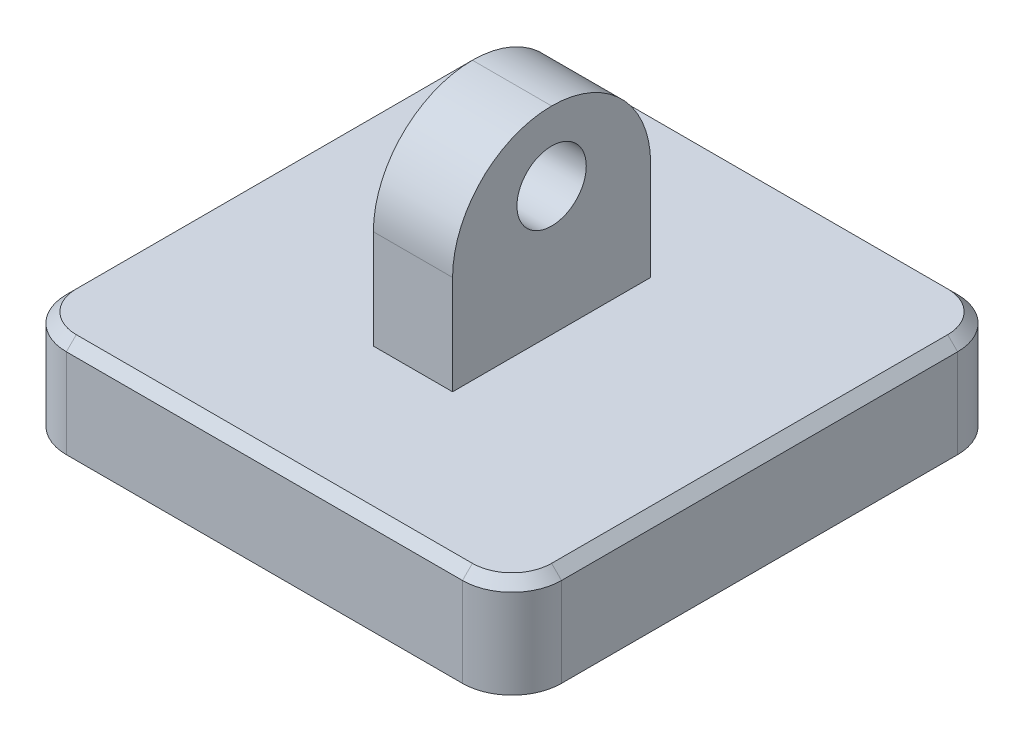
ISO-10303-21;
HEADER;
FILE_DESCRIPTION(('STEP AP214'),'2;1');
FILE_NAME('part.step','',(''),(''),'','','');
FILE_SCHEMA(('AUTOMOTIVE_DESIGN { 1 0 10303 214 1 1 1 1 }'));
ENDSEC;
DATA;
#1=APPLICATION_CONTEXT('core data for automotive mechanical design processes');
#2=APPLICATION_PROTOCOL_DEFINITION('international standard','automotive_design',2000,#1);
#3=PRODUCT_CONTEXT('',#1,'mechanical');
#4=PRODUCT('Part','Part','',(#3));
#5=PRODUCT_RELATED_PRODUCT_CATEGORY('part','',(#4));
#6=PRODUCT_DEFINITION_FORMATION('','',#4);
#7=PRODUCT_DEFINITION_CONTEXT('part definition',#1,'design');
#8=PRODUCT_DEFINITION('design','',#6,#7);
#9=PRODUCT_DEFINITION_SHAPE('','',#8);
#10=(LENGTH_UNIT() NAMED_UNIT(*) SI_UNIT(.MILLI.,.METRE.));
#11=(NAMED_UNIT(*) PLANE_ANGLE_UNIT() SI_UNIT($,.RADIAN.));
#12=(NAMED_UNIT(*) SI_UNIT($,.STERADIAN.) SOLID_ANGLE_UNIT());
#13=UNCERTAINTY_MEASURE_WITH_UNIT(LENGTH_MEASURE(1.E-05),#10,'distance_accuracy_value','');
#14=(GEOMETRIC_REPRESENTATION_CONTEXT(3) GLOBAL_UNCERTAINTY_ASSIGNED_CONTEXT((#13)) GLOBAL_UNIT_ASSIGNED_CONTEXT((#10,
#11,#12)) REPRESENTATION_CONTEXT('',''));
#15=CARTESIAN_POINT('',(0.,0.,0.));
#16=DIRECTION('',(0.,0.,1.));
#17=DIRECTION('',(1.,0.,0.));
#18=AXIS2_PLACEMENT_3D('',#15,#16,#17);
#19=CARTESIAN_POINT('',(0.,10.,0.));
#20=DIRECTION('',(0.,-1.,0.));
#21=DIRECTION('',(0.,0.,-1.));
#22=AXIS2_PLACEMENT_3D('',#19,#20,#21);
#23=PLANE('',#22);
#24=DIRECTION('',(0.,0.,1.));
#25=VECTOR('',#24,1.);
#26=CARTESIAN_POINT('',(-24.,10.,0.));
#27=LINE('',#26,#25);
#28=CARTESIAN_POINT('',(-24.,10.,-20.));
#29=VERTEX_POINT('',#28);
#30=CARTESIAN_POINT('',(-24.,10.,20.));
#31=VERTEX_POINT('',#30);
#32=EDGE_CURVE('E297',#29,#31,#27,.T.);
#33=ORIENTED_EDGE('',*,*,#32,.T.);
#34=CARTESIAN_POINT('',(-20.,10.,20.));
#35=DIRECTION('',(0.,-1.,0.));
#36=DIRECTION('',(0.,0.,-1.));
#37=AXIS2_PLACEMENT_3D('',#34,#35,#36);
#38=CIRCLE('',#37,4.);
#39=CARTESIAN_POINT('',(-20.,10.,24.));
#40=VERTEX_POINT('',#39);
#41=EDGE_CURVE('E300',#31,#40,#38,.F.);
#42=ORIENTED_EDGE('',*,*,#41,.T.);
#43=DIRECTION('',(1.,0.,0.));
#44=VECTOR('',#43,1.);
#45=CARTESIAN_POINT('',(0.,10.,24.));
#46=LINE('',#45,#44);
#47=CARTESIAN_POINT('',(20.,10.,24.));
#48=VERTEX_POINT('',#47);
#49=EDGE_CURVE('E280',#40,#48,#46,.T.);
#50=ORIENTED_EDGE('',*,*,#49,.T.);
#51=CARTESIAN_POINT('',(20.,10.,20.));
#52=DIRECTION('',(0.,-1.,0.));
#53=DIRECTION('',(0.,0.,-1.));
#54=AXIS2_PLACEMENT_3D('',#51,#52,#53);
#55=CIRCLE('',#54,4.);
#56=CARTESIAN_POINT('',(24.,10.,20.));
#57=VERTEX_POINT('',#56);
#58=EDGE_CURVE('E283',#48,#57,#55,.F.);
#59=ORIENTED_EDGE('',*,*,#58,.T.);
#60=DIRECTION('',(0.,0.,-1.));
#61=VECTOR('',#60,1.);
#62=CARTESIAN_POINT('',(24.,10.,0.));
#63=LINE('',#62,#61);
#64=CARTESIAN_POINT('',(24.,10.,-20.));
#65=VERTEX_POINT('',#64);
#66=EDGE_CURVE('E286',#57,#65,#63,.T.);
#67=ORIENTED_EDGE('',*,*,#66,.T.);
#68=CARTESIAN_POINT('',(20.,10.,-20.));
#69=DIRECTION('',(0.,-1.,0.));
#70=DIRECTION('',(0.,0.,-1.));
#71=AXIS2_PLACEMENT_3D('',#68,#69,#70);
#72=CIRCLE('',#71,4.);
#73=CARTESIAN_POINT('',(20.,10.,-24.));
#74=VERTEX_POINT('',#73);
#75=EDGE_CURVE('E289',#65,#74,#72,.F.);
#76=ORIENTED_EDGE('',*,*,#75,.T.);
#77=DIRECTION('',(-1.,0.,0.));
#78=VECTOR('',#77,1.);
#79=CARTESIAN_POINT('',(0.,10.,-24.));
#80=LINE('',#79,#78);
#81=CARTESIAN_POINT('',(-20.,10.,-24.));
#82=VERTEX_POINT('',#81);
#83=EDGE_CURVE('E291',#74,#82,#80,.T.);
#84=ORIENTED_EDGE('',*,*,#83,.T.);
#85=CARTESIAN_POINT('',(-20.,10.,-20.));
#86=DIRECTION('',(0.,-1.,0.));
#87=DIRECTION('',(0.,0.,-1.));
#88=AXIS2_PLACEMENT_3D('',#85,#86,#87);
#89=CIRCLE('',#88,4.);
#90=EDGE_CURVE('E294',#82,#29,#89,.F.);
#91=ORIENTED_EDGE('',*,*,#90,.T.);
#92=EDGE_LOOP('',(#33,#42,#50,#59,#67,#76,#84,#91));
#93=FACE_BOUND('',#92,.T.);
#94=DIRECTION('',(0.,0.,1.));
#95=VECTOR('',#94,1.);
#96=CARTESIAN_POINT('',(-4.,10.,-10.));
#97=LINE('',#96,#95);
#98=CARTESIAN_POINT('',(-4.,10.,-10.));
#99=VERTEX_POINT('',#98);
#100=CARTESIAN_POINT('',(-4.,10.,10.));
#101=VERTEX_POINT('',#100);
#102=EDGE_CURVE('E165',#99,#101,#97,.T.);
#103=ORIENTED_EDGE('',*,*,#102,.F.);
#104=DIRECTION('',(-1.,0.,0.));
#105=VECTOR('',#104,1.);
#106=CARTESIAN_POINT('',(4.,10.,-10.));
#107=LINE('',#106,#105);
#108=CARTESIAN_POINT('',(4.,10.,-10.));
#109=VERTEX_POINT('',#108);
#110=EDGE_CURVE('E174',#109,#99,#107,.T.);
#111=ORIENTED_EDGE('',*,*,#110,.F.);
#112=DIRECTION('',(0.,0.,-1.));
#113=VECTOR('',#112,1.);
#114=CARTESIAN_POINT('',(4.,10.,-10.));
#115=LINE('',#114,#113);
#116=CARTESIAN_POINT('',(4.,10.,10.));
#117=VERTEX_POINT('',#116);
#118=EDGE_CURVE('E189',#117,#109,#115,.T.);
#119=ORIENTED_EDGE('',*,*,#118,.F.);
#120=DIRECTION('',(1.,0.,0.));
#121=VECTOR('',#120,1.);
#122=CARTESIAN_POINT('',(4.,10.,10.));
#123=LINE('',#122,#121);
#124=EDGE_CURVE('E182',#101,#117,#123,.T.);
#125=ORIENTED_EDGE('',*,*,#124,.F.);
#126=EDGE_LOOP('',(#103,#111,#119,#125));
#127=FACE_BOUND('',#126,.T.);
#128=ADVANCED_FACE('F39',(#93,#127),#23,.F.);
#129=CARTESIAN_POINT('',(25.,10.,25.));
#130=DIRECTION('',(-1.,0.,0.));
#131=DIRECTION('',(0.,0.,1.));
#132=AXIS2_PLACEMENT_3D('',#129,#130,#131);
#133=PLANE('',#132);
#134=DIRECTION('',(0.,-1.,0.));
#135=VECTOR('',#134,1.);
#136=CARTESIAN_POINT('',(25.,10.,-20.));
#137=LINE('',#136,#135);
#138=CARTESIAN_POINT('',(25.,0.,-20.));
#139=VERTEX_POINT('',#138);
#140=CARTESIAN_POINT('',(25.,8.99999999999999,-20.));
#141=VERTEX_POINT('',#140);
#142=EDGE_CURVE('E271',#139,#141,#137,.F.);
#143=ORIENTED_EDGE('',*,*,#142,.T.);
#144=DIRECTION('',(0.,0.,1.));
#145=VECTOR('',#144,1.);
#146=CARTESIAN_POINT('',(25.,8.99999999999999,25.));
#147=LINE('',#146,#145);
#148=CARTESIAN_POINT('',(25.,8.99999999999999,20.));
#149=VERTEX_POINT('',#148);
#150=EDGE_CURVE('E64',#141,#149,#147,.T.);
#151=ORIENTED_EDGE('',*,*,#150,.T.);
#152=DIRECTION('',(0.,-1.,0.));
#153=VECTOR('',#152,1.);
#154=CARTESIAN_POINT('',(25.,10.,20.));
#155=LINE('',#154,#153);
#156=CARTESIAN_POINT('',(25.,0.,20.));
#157=VERTEX_POINT('',#156);
#158=EDGE_CURVE('E268',#149,#157,#155,.T.);
#159=ORIENTED_EDGE('',*,*,#158,.T.);
#160=DIRECTION('',(0.,0.,-1.));
#161=VECTOR('',#160,1.);
#162=CARTESIAN_POINT('',(25.,0.,25.));
#163=LINE('',#162,#161);
#164=EDGE_CURVE('E205',#157,#139,#163,.T.);
#165=ORIENTED_EDGE('',*,*,#164,.T.);
#166=EDGE_LOOP('',(#143,#151,#159,#165));
#167=FACE_BOUND('',#166,.T.);
#168=ADVANCED_FACE('F367',(#167),#133,.F.);
#169=CARTESIAN_POINT('',(-25.,10.,-25.));
#170=DIRECTION('',(0.,0.,1.));
#171=DIRECTION('',(1.,0.,0.));
#172=AXIS2_PLACEMENT_3D('',#169,#170,#171);
#173=PLANE('',#172);
#174=DIRECTION('',(0.,-1.,0.));
#175=VECTOR('',#174,1.);
#176=CARTESIAN_POINT('',(-20.,10.,-25.));
#177=LINE('',#176,#175);
#178=CARTESIAN_POINT('',(-20.,0.,-25.));
#179=VERTEX_POINT('',#178);
#180=CARTESIAN_POINT('',(-20.,8.99999999999999,-25.));
#181=VERTEX_POINT('',#180);
#182=EDGE_CURVE('E264',#179,#181,#177,.F.);
#183=ORIENTED_EDGE('',*,*,#182,.T.);
#184=DIRECTION('',(1.,0.,0.));
#185=VECTOR('',#184,1.);
#186=CARTESIAN_POINT('',(-25.,8.99999999999999,-25.));
#187=LINE('',#186,#185);
#188=CARTESIAN_POINT('',(20.,8.99999999999999,-25.));
#189=VERTEX_POINT('',#188);
#190=EDGE_CURVE('E314',#181,#189,#187,.T.);
#191=ORIENTED_EDGE('',*,*,#190,.T.);
#192=DIRECTION('',(0.,-1.,0.));
#193=VECTOR('',#192,1.);
#194=CARTESIAN_POINT('',(20.,10.,-25.));
#195=LINE('',#194,#193);
#196=CARTESIAN_POINT('',(20.,0.,-25.));
#197=VERTEX_POINT('',#196);
#198=EDGE_CURVE('E261',#189,#197,#195,.T.);
#199=ORIENTED_EDGE('',*,*,#198,.T.);
#200=DIRECTION('',(-1.,0.,0.));
#201=VECTOR('',#200,1.);
#202=CARTESIAN_POINT('',(-25.,0.,-25.));
#203=LINE('',#202,#201);
#204=EDGE_CURVE('E208',#197,#179,#203,.T.);
#205=ORIENTED_EDGE('',*,*,#204,.T.);
#206=EDGE_LOOP('',(#183,#191,#199,#205));
#207=FACE_BOUND('',#206,.T.);
#208=ADVANCED_FACE('F378',(#207),#173,.F.);
#209=CARTESIAN_POINT('',(-25.,10.,25.));
#210=DIRECTION('',(1.,0.,0.));
#211=DIRECTION('',(0.,0.,-1.));
#212=AXIS2_PLACEMENT_3D('',#209,#210,#211);
#213=PLANE('',#212);
#214=DIRECTION('',(0.,-1.,0.));
#215=VECTOR('',#214,1.);
#216=CARTESIAN_POINT('',(-25.,10.,20.));
#217=LINE('',#216,#215);
#218=CARTESIAN_POINT('',(-25.,0.,20.));
#219=VERTEX_POINT('',#218);
#220=CARTESIAN_POINT('',(-25.,8.99999999999999,20.));
#221=VERTEX_POINT('',#220);
#222=EDGE_CURVE('E237',#219,#221,#217,.F.);
#223=ORIENTED_EDGE('',*,*,#222,.T.);
#224=DIRECTION('',(0.,0.,-1.));
#225=VECTOR('',#224,1.);
#226=CARTESIAN_POINT('',(-25.,8.99999999999999,25.));
#227=LINE('',#226,#225);
#228=CARTESIAN_POINT('',(-25.,8.99999999999999,-20.));
#229=VERTEX_POINT('',#228);
#230=EDGE_CURVE('E308',#221,#229,#227,.T.);
#231=ORIENTED_EDGE('',*,*,#230,.T.);
#232=DIRECTION('',(0.,-1.,0.));
#233=VECTOR('',#232,1.);
#234=CARTESIAN_POINT('',(-25.,10.,-20.));
#235=LINE('',#234,#233);
#236=CARTESIAN_POINT('',(-25.,0.,-20.));
#237=VERTEX_POINT('',#236);
#238=EDGE_CURVE('E246',#229,#237,#235,.T.);
#239=ORIENTED_EDGE('',*,*,#238,.T.);
#240=DIRECTION('',(0.,0.,1.));
#241=VECTOR('',#240,1.);
#242=CARTESIAN_POINT('',(-25.,0.,25.));
#243=LINE('',#242,#241);
#244=EDGE_CURVE('E212',#237,#219,#243,.T.);
#245=ORIENTED_EDGE('',*,*,#244,.T.);
#246=EDGE_LOOP('',(#223,#231,#239,#245));
#247=FACE_BOUND('',#246,.T.);
#248=ADVANCED_FACE('F435',(#247),#213,.F.);
#249=CARTESIAN_POINT('',(-25.,10.,25.));
#250=DIRECTION('',(0.,0.,-1.));
#251=DIRECTION('',(-1.,0.,0.));
#252=AXIS2_PLACEMENT_3D('',#249,#250,#251);
#253=PLANE('',#252);
#254=DIRECTION('',(0.,-1.,0.));
#255=VECTOR('',#254,1.);
#256=CARTESIAN_POINT('',(20.,10.,25.));
#257=LINE('',#256,#255);
#258=CARTESIAN_POINT('',(20.,0.,25.));
#259=VERTEX_POINT('',#258);
#260=CARTESIAN_POINT('',(20.,8.99999999999999,25.));
#261=VERTEX_POINT('',#260);
#262=EDGE_CURVE('E277',#259,#261,#257,.F.);
#263=ORIENTED_EDGE('',*,*,#262,.T.);
#264=DIRECTION('',(-1.,0.,0.));
#265=VECTOR('',#264,1.);
#266=CARTESIAN_POINT('',(-25.,8.99999999999999,25.));
#267=LINE('',#266,#265);
#268=CARTESIAN_POINT('',(-20.,8.99999999999999,25.));
#269=VERTEX_POINT('',#268);
#270=EDGE_CURVE('E11',#261,#269,#267,.T.);
#271=ORIENTED_EDGE('',*,*,#270,.T.);
#272=DIRECTION('',(0.,-1.,0.));
#273=VECTOR('',#272,1.);
#274=CARTESIAN_POINT('',(-20.,10.,25.));
#275=LINE('',#274,#273);
#276=CARTESIAN_POINT('',(-20.,0.,25.));
#277=VERTEX_POINT('',#276);
#278=EDGE_CURVE('E274',#269,#277,#275,.T.);
#279=ORIENTED_EDGE('',*,*,#278,.T.);
#280=DIRECTION('',(1.,0.,0.));
#281=VECTOR('',#280,1.);
#282=CARTESIAN_POINT('',(-25.,0.,25.));
#283=LINE('',#282,#281);
#284=EDGE_CURVE('E216',#277,#259,#283,.T.);
#285=ORIENTED_EDGE('',*,*,#284,.T.);
#286=EDGE_LOOP('',(#263,#271,#279,#285));
#287=FACE_BOUND('',#286,.T.);
#288=ADVANCED_FACE('F407',(#287),#253,.F.);
#289=CARTESIAN_POINT('',(0.,0.,0.));
#290=DIRECTION('',(0.,-1.,0.));
#291=DIRECTION('',(0.,0.,-1.));
#292=AXIS2_PLACEMENT_3D('',#289,#290,#291);
#293=PLANE('',#292);
#294=ORIENTED_EDGE('',*,*,#244,.F.);
#295=CARTESIAN_POINT('',(-20.,0.,-20.));
#296=DIRECTION('',(0.,-1.,0.));
#297=DIRECTION('',(0.,0.,-1.));
#298=AXIS2_PLACEMENT_3D('',#295,#296,#297);
#299=CIRCLE('',#298,5.);
#300=EDGE_CURVE('E258',#237,#179,#299,.T.);
#301=ORIENTED_EDGE('',*,*,#300,.T.);
#302=ORIENTED_EDGE('',*,*,#204,.F.);
#303=CARTESIAN_POINT('',(20.,0.,-20.));
#304=DIRECTION('',(0.,-1.,0.));
#305=DIRECTION('',(0.,0.,-1.));
#306=AXIS2_PLACEMENT_3D('',#303,#304,#305);
#307=CIRCLE('',#306,5.);
#308=EDGE_CURVE('E255',#197,#139,#307,.T.);
#309=ORIENTED_EDGE('',*,*,#308,.T.);
#310=ORIENTED_EDGE('',*,*,#164,.F.);
#311=CARTESIAN_POINT('',(20.,0.,20.));
#312=DIRECTION('',(0.,-1.,0.));
#313=DIRECTION('',(0.,0.,-1.));
#314=AXIS2_PLACEMENT_3D('',#311,#312,#313);
#315=CIRCLE('',#314,5.);
#316=EDGE_CURVE('E252',#157,#259,#315,.T.);
#317=ORIENTED_EDGE('',*,*,#316,.T.);
#318=ORIENTED_EDGE('',*,*,#284,.F.);
#319=CARTESIAN_POINT('',(-20.,0.,20.));
#320=DIRECTION('',(0.,-1.,0.));
#321=DIRECTION('',(0.,0.,-1.));
#322=AXIS2_PLACEMENT_3D('',#319,#320,#321);
#323=CIRCLE('',#322,5.);
#324=EDGE_CURVE('E249',#277,#219,#323,.T.);
#325=ORIENTED_EDGE('',*,*,#324,.T.);
#326=EDGE_LOOP('',(#294,#301,#302,#309,#310,#317,#318,#325));
#327=FACE_BOUND('',#326,.T.);
#328=ADVANCED_FACE('F372',(#327),#293,.T.);
#329=CARTESIAN_POINT('',(-4.,30.,-10.));
#330=DIRECTION('',(1.,0.,0.));
#331=DIRECTION('',(0.,0.,-1.));
#332=AXIS2_PLACEMENT_3D('',#329,#330,#331);
#333=PLANE('',#332);
#334=CARTESIAN_POINT('',(-4.,23.,0.));
#335=DIRECTION('',(1.,0.,0.));
#336=DIRECTION('',(0.,0.,-1.));
#337=AXIS2_PLACEMENT_3D('',#334,#335,#336);
#338=CIRCLE('',#337,3.5);
#339=CARTESIAN_POINT('',(-4.,23.,-3.5));
#340=VERTEX_POINT('',#339);
#341=EDGE_CURVE('E184',#340,#340,#338,.T.);
#342=ORIENTED_EDGE('',*,*,#341,.T.);
#343=EDGE_LOOP('',(#342));
#344=FACE_BOUND('',#343,.T.);
#345=CARTESIAN_POINT('',(-4.,20.,0.));
#346=DIRECTION('',(1.,0.,0.));
#347=DIRECTION('',(0.,0.,-1.));
#348=AXIS2_PLACEMENT_3D('',#345,#346,#347);
#349=CIRCLE('',#348,10.);
#350=CARTESIAN_POINT('',(-4.,20.,10.));
#351=VERTEX_POINT('',#350);
#352=CARTESIAN_POINT('',(-4.,30.,0.));
#353=VERTEX_POINT('',#352);
#354=EDGE_CURVE('E220',#351,#353,#349,.F.);
#355=ORIENTED_EDGE('',*,*,#354,.T.);
#356=CARTESIAN_POINT('',(-4.,20.,0.));
#357=DIRECTION('',(1.,0.,0.));
#358=DIRECTION('',(0.,0.,-1.));
#359=AXIS2_PLACEMENT_3D('',#356,#357,#358);
#360=CIRCLE('',#359,10.);
#361=CARTESIAN_POINT('',(-4.,20.,-10.));
#362=VERTEX_POINT('',#361);
#363=EDGE_CURVE('E167',#353,#362,#360,.F.);
#364=ORIENTED_EDGE('',*,*,#363,.T.);
#365=DIRECTION('',(0.,-1.,0.));
#366=VECTOR('',#365,1.);
#367=CARTESIAN_POINT('',(-4.,30.,-10.));
#368=LINE('',#367,#366);
#369=EDGE_CURVE('E161',#362,#99,#368,.T.);
#370=ORIENTED_EDGE('',*,*,#369,.T.);
#371=ORIENTED_EDGE('',*,*,#102,.T.);
#372=DIRECTION('',(0.,-1.,0.));
#373=VECTOR('',#372,1.);
#374=CARTESIAN_POINT('',(-4.,30.,10.));
#375=LINE('',#374,#373);
#376=EDGE_CURVE('E202',#351,#101,#375,.T.);
#377=ORIENTED_EDGE('',*,*,#376,.F.);
#378=EDGE_LOOP('',(#355,#364,#370,#371,#377));
#379=FACE_BOUND('',#378,.T.);
#380=ADVANCED_FACE('F163',(#344,#379),#333,.F.);
#381=CARTESIAN_POINT('',(4.,30.,10.));
#382=DIRECTION('',(0.,0.,-1.));
#383=DIRECTION('',(-1.,0.,0.));
#384=AXIS2_PLACEMENT_3D('',#381,#382,#383);
#385=PLANE('',#384);
#386=DIRECTION('',(0.,-1.,0.));
#387=VECTOR('',#386,1.);
#388=CARTESIAN_POINT('',(4.,30.,10.));
#389=LINE('',#388,#387);
#390=CARTESIAN_POINT('',(4.,20.,10.));
#391=VERTEX_POINT('',#390);
#392=EDGE_CURVE('E199',#391,#117,#389,.T.);
#393=ORIENTED_EDGE('',*,*,#392,.F.);
#394=DIRECTION('',(1.,0.,0.));
#395=VECTOR('',#394,1.);
#396=CARTESIAN_POINT('',(4.,20.,10.));
#397=LINE('',#396,#395);
#398=EDGE_CURVE('E234',#391,#351,#397,.F.);
#399=ORIENTED_EDGE('',*,*,#398,.T.);
#400=ORIENTED_EDGE('',*,*,#376,.T.);
#401=ORIENTED_EDGE('',*,*,#124,.T.);
#402=EDGE_LOOP('',(#393,#399,#400,#401));
#403=FACE_BOUND('',#402,.T.);
#404=ADVANCED_FACE('F583',(#403),#385,.F.);
#405=CARTESIAN_POINT('',(4.,30.,-10.));
#406=DIRECTION('',(-1.,0.,0.));
#407=DIRECTION('',(0.,0.,1.));
#408=AXIS2_PLACEMENT_3D('',#405,#406,#407);
#409=PLANE('',#408);
#410=CARTESIAN_POINT('',(4.,23.,0.));
#411=DIRECTION('',(1.,0.,0.));
#412=DIRECTION('',(0.,0.,-1.));
#413=AXIS2_PLACEMENT_3D('',#410,#411,#412);
#414=CIRCLE('',#413,3.5);
#415=CARTESIAN_POINT('',(4.,23.,-3.5));
#416=VERTEX_POINT('',#415);
#417=EDGE_CURVE('E242',#416,#416,#414,.T.);
#418=ORIENTED_EDGE('',*,*,#417,.F.);
#419=EDGE_LOOP('',(#418));
#420=FACE_BOUND('',#419,.T.);
#421=DIRECTION('',(0.,-1.,0.));
#422=VECTOR('',#421,1.);
#423=CARTESIAN_POINT('',(4.,30.,-10.));
#424=LINE('',#423,#422);
#425=CARTESIAN_POINT('',(4.,20.,-10.));
#426=VERTEX_POINT('',#425);
#427=EDGE_CURVE('E173',#426,#109,#424,.T.);
#428=ORIENTED_EDGE('',*,*,#427,.F.);
#429=CARTESIAN_POINT('',(4.,20.,0.));
#430=DIRECTION('',(-1.,0.,0.));
#431=DIRECTION('',(0.,0.,1.));
#432=AXIS2_PLACEMENT_3D('',#429,#430,#431);
#433=CIRCLE('',#432,10.);
#434=CARTESIAN_POINT('',(4.,30.,0.));
#435=VERTEX_POINT('',#434);
#436=EDGE_CURVE('E231',#426,#435,#433,.F.);
#437=ORIENTED_EDGE('',*,*,#436,.T.);
#438=CARTESIAN_POINT('',(4.,20.,0.));
#439=DIRECTION('',(-1.,0.,0.));
#440=DIRECTION('',(0.,0.,1.));
#441=AXIS2_PLACEMENT_3D('',#438,#439,#440);
#442=CIRCLE('',#441,10.);
#443=EDGE_CURVE('E228',#435,#391,#442,.F.);
#444=ORIENTED_EDGE('',*,*,#443,.T.);
#445=ORIENTED_EDGE('',*,*,#392,.T.);
#446=ORIENTED_EDGE('',*,*,#118,.T.);
#447=EDGE_LOOP('',(#428,#437,#444,#445,#446));
#448=FACE_BOUND('',#447,.T.);
#449=ADVANCED_FACE('F574',(#420,#448),#409,.F.);
#450=CARTESIAN_POINT('',(4.,30.,-10.));
#451=DIRECTION('',(0.,0.,1.));
#452=DIRECTION('',(1.,0.,0.));
#453=AXIS2_PLACEMENT_3D('',#450,#451,#452);
#454=PLANE('',#453);
#455=ORIENTED_EDGE('',*,*,#369,.F.);
#456=DIRECTION('',(-1.,0.,0.));
#457=VECTOR('',#456,1.);
#458=CARTESIAN_POINT('',(4.,20.,-10.));
#459=LINE('',#458,#457);
#460=EDGE_CURVE('E225',#362,#426,#459,.F.);
#461=ORIENTED_EDGE('',*,*,#460,.T.);
#462=ORIENTED_EDGE('',*,*,#427,.T.);
#463=ORIENTED_EDGE('',*,*,#110,.T.);
#464=EDGE_LOOP('',(#455,#461,#462,#463));
#465=FACE_BOUND('',#464,.T.);
#466=ADVANCED_FACE('F186',(#465),#454,.F.);
#467=CARTESIAN_POINT('',(-25.,23.,0.));
#468=DIRECTION('',(1.,0.,0.));
#469=DIRECTION('',(0.,0.,-1.));
#470=AXIS2_PLACEMENT_3D('',#467,#468,#469);
#471=CYLINDRICAL_SURFACE('',#470,3.5);
#472=CARTESIAN_POINT('',(4.,23.,-3.5));
#473=CARTESIAN_POINT('',(3.91666666666666,23.,-3.5));
#474=CARTESIAN_POINT('',(3.83333333333333,23.,-3.5));
#475=CARTESIAN_POINT('',(3.66666666666666,23.,-3.5));
#476=CARTESIAN_POINT('',(3.58333333333333,23.,-3.5));
#477=CARTESIAN_POINT('',(3.41666666666666,23.,-3.5));
#478=CARTESIAN_POINT('',(3.33333333333333,23.,-3.5));
#479=CARTESIAN_POINT('',(3.16666666666666,23.,-3.5));
#480=CARTESIAN_POINT('',(3.08333333333333,23.,-3.5));
#481=CARTESIAN_POINT('',(2.91666666666666,23.,-3.5));
#482=CARTESIAN_POINT('',(2.83333333333333,23.,-3.5));
#483=CARTESIAN_POINT('',(2.66666666666666,23.,-3.5));
#484=CARTESIAN_POINT('',(2.58333333333333,23.,-3.5));
#485=CARTESIAN_POINT('',(2.41666666666666,23.,-3.5));
#486=CARTESIAN_POINT('',(2.33333333333333,23.,-3.5));
#487=CARTESIAN_POINT('',(2.16666666666666,23.,-3.5));
#488=CARTESIAN_POINT('',(2.08333333333333,23.,-3.5));
#489=CARTESIAN_POINT('',(1.91666666666666,23.,-3.5));
#490=CARTESIAN_POINT('',(1.83333333333333,23.,-3.5));
#491=CARTESIAN_POINT('',(1.66666666666666,23.,-3.5));
#492=CARTESIAN_POINT('',(1.58333333333333,23.,-3.5));
#493=CARTESIAN_POINT('',(1.41666666666666,23.,-3.5));
#494=CARTESIAN_POINT('',(1.33333333333333,23.,-3.5));
#495=CARTESIAN_POINT('',(1.16666666666666,23.,-3.5));
#496=CARTESIAN_POINT('',(1.08333333333333,23.,-3.5));
#497=CARTESIAN_POINT('',(0.916666666666664,23.,-3.5));
#498=CARTESIAN_POINT('',(0.833333333333331,23.,-3.5));
#499=CARTESIAN_POINT('',(0.666666666666664,23.,-3.5));
#500=CARTESIAN_POINT('',(0.58333333333333,23.,-3.5));
#501=CARTESIAN_POINT('',(0.416666666666664,23.,-3.5));
#502=CARTESIAN_POINT('',(0.33333333333333,23.,-3.5));
#503=CARTESIAN_POINT('',(0.166666666666663,23.,-3.5));
#504=CARTESIAN_POINT('',(0.0833333333333299,23.,-3.5));
#505=CARTESIAN_POINT('',(-0.0833333333333369,23.,-3.5));
#506=CARTESIAN_POINT('',(-0.16666666666667,23.,-3.5));
#507=CARTESIAN_POINT('',(-0.333333333333337,23.,-3.5));
#508=CARTESIAN_POINT('',(-0.416666666666671,23.,-3.5));
#509=CARTESIAN_POINT('',(-0.583333333333337,23.,-3.5));
#510=CARTESIAN_POINT('',(-0.666666666666671,23.,-3.5));
#511=CARTESIAN_POINT('',(-0.833333333333337,23.,-3.5));
#512=CARTESIAN_POINT('',(-0.916666666666671,23.,-3.5));
#513=CARTESIAN_POINT('',(-1.08333333333334,23.,-3.5));
#514=CARTESIAN_POINT('',(-1.16666666666667,23.,-3.5));
#515=CARTESIAN_POINT('',(-1.33333333333334,23.,-3.5));
#516=CARTESIAN_POINT('',(-1.41666666666667,23.,-3.5));
#517=CARTESIAN_POINT('',(-1.58333333333333,23.,-3.5));
#518=CARTESIAN_POINT('',(-1.66666666666667,23.,-3.5));
#519=CARTESIAN_POINT('',(-1.83333333333334,23.,-3.5));
#520=CARTESIAN_POINT('',(-1.91666666666667,23.,-3.5));
#521=CARTESIAN_POINT('',(-2.08333333333334,23.,-3.5));
#522=CARTESIAN_POINT('',(-2.16666666666667,23.,-3.5));
#523=CARTESIAN_POINT('',(-2.33333333333334,23.,-3.5));
#524=CARTESIAN_POINT('',(-2.41666666666667,23.,-3.5));
#525=CARTESIAN_POINT('',(-2.58333333333334,23.,-3.5));
#526=CARTESIAN_POINT('',(-2.66666666666667,23.,-3.5));
#527=CARTESIAN_POINT('',(-2.83333333333334,23.,-3.5));
#528=CARTESIAN_POINT('',(-2.91666666666667,23.,-3.5));
#529=CARTESIAN_POINT('',(-3.08333333333334,23.,-3.5));
#530=CARTESIAN_POINT('',(-3.16666666666667,23.,-3.5));
#531=CARTESIAN_POINT('',(-3.33333333333334,23.,-3.5));
#532=CARTESIAN_POINT('',(-3.41666666666667,23.,-3.5));
#533=CARTESIAN_POINT('',(-3.58333333333334,23.,-3.5));
#534=CARTESIAN_POINT('',(-3.66666666666667,23.,-3.5));
#535=CARTESIAN_POINT('',(-3.83333333333334,23.,-3.5));
#536=CARTESIAN_POINT('',(-3.91666666666667,23.,-3.5));
#537=CARTESIAN_POINT('',(-4.,23.,-3.5));
#538=B_SPLINE_CURVE_WITH_KNOTS('',3,(#472,#473,#474,#475,#476,#477,#478,#479,#480,#481,#482,
#483,#484,#485,#486,#487,#488,#489,#490,#491,#492,#493,#494,#495,#496,#497,#498,#499,#500,#501,
#502,#503,#504,#505,#506,#507,#508,#509,#510,#511,#512,#513,#514,#515,#516,#517,#518,#519,#520,
#521,#522,#523,#524,#525,#526,#527,#528,#529,#530,#531,#532,#533,#534,#535,#536,#537),
.UNSPECIFIED.,.F.,.F.,(4,2,2,2,2,2,2,2,2,2,2,2,2,2,2,2,2,2,2,2,2,2,2,2,2,2,2,2,2,2,2,2,4),(0.,
0.25,0.5,0.750000000000001,1.,1.25,1.5,1.75,2.,2.25,2.5,2.75,3.,3.25,3.5,3.75,4.,4.25,4.5,4.75,
5.,5.25,5.5,5.75,6.,6.25,6.5,6.75,7.,7.25,7.5,7.75,8.),.UNSPECIFIED.);
#539=EDGE_CURVE('BSEAM448',#416,#340,#538,.T.);
#540=ORIENTED_EDGE('',*,*,#417,.T.);
#541=ORIENTED_EDGE('',*,*,#341,.F.);
#542=ORIENTED_EDGE('',*,*,#539,.T.);
#543=ORIENTED_EDGE('',*,*,#539,.F.);
#544=EDGE_LOOP('',(#540,#542,#541,#543));
#545=FACE_BOUND('',#544,.T.);
#546=ADVANCED_FACE('F448',(#545),#471,.F.);
#547=CARTESIAN_POINT('',(0.,20.,0.));
#548=DIRECTION('',(1.,0.,0.));
#549=DIRECTION('',(0.,0.,-1.));
#550=AXIS2_PLACEMENT_3D('',#547,#548,#549);
#551=CYLINDRICAL_SURFACE('',#550,10.);
#552=ORIENTED_EDGE('',*,*,#398,.F.);
#553=ORIENTED_EDGE('',*,*,#443,.F.);
#554=DIRECTION('',(1.,0.,0.));
#555=VECTOR('',#554,1.);
#556=CARTESIAN_POINT('',(0.,30.,0.));
#557=LINE('',#556,#555);
#558=EDGE_CURVE('E238',#353,#435,#557,.T.);
#559=ORIENTED_EDGE('',*,*,#558,.F.);
#560=ORIENTED_EDGE('',*,*,#354,.F.);
#561=EDGE_LOOP('',(#552,#553,#559,#560));
#562=FACE_BOUND('',#561,.T.);
#563=ADVANCED_FACE('F444',(#562),#551,.T.);
#564=CARTESIAN_POINT('',(0.,20.,0.));
#565=DIRECTION('',(-1.,0.,0.));
#566=DIRECTION('',(0.,0.,1.));
#567=AXIS2_PLACEMENT_3D('',#564,#565,#566);
#568=CYLINDRICAL_SURFACE('',#567,10.);
#569=ORIENTED_EDGE('',*,*,#436,.F.);
#570=ORIENTED_EDGE('',*,*,#460,.F.);
#571=ORIENTED_EDGE('',*,*,#363,.F.);
#572=ORIENTED_EDGE('',*,*,#558,.T.);
#573=EDGE_LOOP('',(#569,#570,#571,#572));
#574=FACE_BOUND('',#573,.T.);
#575=ADVANCED_FACE('F441',(#574),#568,.T.);
#576=CARTESIAN_POINT('',(-20.,10.,-20.));
#577=DIRECTION('',(0.,-1.,0.));
#578=DIRECTION('',(0.,0.,-1.));
#579=AXIS2_PLACEMENT_3D('',#576,#577,#578);
#580=CYLINDRICAL_SURFACE('',#579,5.);
#581=ORIENTED_EDGE('',*,*,#238,.F.);
#582=CARTESIAN_POINT('',(-20.,8.99999999999999,-20.));
#583=DIRECTION('',(0.,-1.,0.));
#584=DIRECTION('',(0.,0.,-1.));
#585=AXIS2_PLACEMENT_3D('',#582,#583,#584);
#586=CIRCLE('',#585,5.);
#587=EDGE_CURVE('E311',#229,#181,#586,.T.);
#588=ORIENTED_EDGE('',*,*,#587,.T.);
#589=ORIENTED_EDGE('',*,*,#182,.F.);
#590=ORIENTED_EDGE('',*,*,#300,.F.);
#591=EDGE_LOOP('',(#581,#588,#589,#590));
#592=FACE_BOUND('',#591,.T.);
#593=ADVANCED_FACE('F381',(#592),#580,.T.);
#594=CARTESIAN_POINT('',(20.,10.,-20.));
#595=DIRECTION('',(0.,-1.,0.));
#596=DIRECTION('',(0.,0.,-1.));
#597=AXIS2_PLACEMENT_3D('',#594,#595,#596);
#598=CYLINDRICAL_SURFACE('',#597,5.);
#599=ORIENTED_EDGE('',*,*,#198,.F.);
#600=CARTESIAN_POINT('',(20.,8.99999999999999,-20.));
#601=DIRECTION('',(0.,-1.,0.));
#602=DIRECTION('',(0.,0.,-1.));
#603=AXIS2_PLACEMENT_3D('',#600,#601,#602);
#604=CIRCLE('',#603,5.);
#605=EDGE_CURVE('E317',#189,#141,#604,.T.);
#606=ORIENTED_EDGE('',*,*,#605,.T.);
#607=ORIENTED_EDGE('',*,*,#142,.F.);
#608=ORIENTED_EDGE('',*,*,#308,.F.);
#609=EDGE_LOOP('',(#599,#606,#607,#608));
#610=FACE_BOUND('',#609,.T.);
#611=ADVANCED_FACE('F365',(#610),#598,.T.);
#612=CARTESIAN_POINT('',(20.,10.,20.));
#613=DIRECTION('',(0.,-1.,0.));
#614=DIRECTION('',(0.,0.,-1.));
#615=AXIS2_PLACEMENT_3D('',#612,#613,#614);
#616=CYLINDRICAL_SURFACE('',#615,5.);
#617=ORIENTED_EDGE('',*,*,#158,.F.);
#618=CARTESIAN_POINT('',(20.,8.99999999999999,20.));
#619=DIRECTION('',(0.,-1.,0.));
#620=DIRECTION('',(0.,0.,-1.));
#621=AXIS2_PLACEMENT_3D('',#618,#619,#620);
#622=CIRCLE('',#621,5.);
#623=EDGE_CURVE('E49',#149,#261,#622,.T.);
#624=ORIENTED_EDGE('',*,*,#623,.T.);
#625=ORIENTED_EDGE('',*,*,#262,.F.);
#626=ORIENTED_EDGE('',*,*,#316,.F.);
#627=EDGE_LOOP('',(#617,#624,#625,#626));
#628=FACE_BOUND('',#627,.T.);
#629=ADVANCED_FACE('F454',(#628),#616,.T.);
#630=CARTESIAN_POINT('',(-20.,10.,20.));
#631=DIRECTION('',(0.,-1.,0.));
#632=DIRECTION('',(0.,0.,-1.));
#633=AXIS2_PLACEMENT_3D('',#630,#631,#632);
#634=CYLINDRICAL_SURFACE('',#633,5.);
#635=ORIENTED_EDGE('',*,*,#278,.F.);
#636=CARTESIAN_POINT('',(-20.,8.99999999999999,20.));
#637=DIRECTION('',(0.,-1.,0.));
#638=DIRECTION('',(0.,0.,-1.));
#639=AXIS2_PLACEMENT_3D('',#636,#637,#638);
#640=CIRCLE('',#639,5.);
#641=EDGE_CURVE('E304',#269,#221,#640,.T.);
#642=ORIENTED_EDGE('',*,*,#641,.T.);
#643=ORIENTED_EDGE('',*,*,#222,.F.);
#644=ORIENTED_EDGE('',*,*,#324,.F.);
#645=EDGE_LOOP('',(#635,#642,#643,#644));
#646=FACE_BOUND('',#645,.T.);
#647=ADVANCED_FACE('F411',(#646),#634,.T.);
#648=CARTESIAN_POINT('',(20.,10.,-20.));
#649=DIRECTION('',(0.,-1.,0.));
#650=DIRECTION('',(0.,0.,-1.));
#651=AXIS2_PLACEMENT_3D('',#648,#649,#650);
#652=CONICAL_SURFACE('',#651,4.,0.785398163397444);
#653=DIRECTION('',(-0.707106781186545,0.70710678118655,0.));
#654=VECTOR('',#653,1.);
#655=CARTESIAN_POINT('',(25.,8.99999999999999,-20.));
#656=LINE('',#655,#654);
#657=EDGE_CURVE('E345',#141,#65,#656,.T.);
#658=ORIENTED_EDGE('',*,*,#657,.F.);
#659=ORIENTED_EDGE('',*,*,#605,.F.);
#660=DIRECTION('',(0.,-0.70710678118655,-0.707106781186545));
#661=VECTOR('',#660,1.);
#662=CARTESIAN_POINT('',(20.,10.,-24.));
#663=LINE('',#662,#661);
#664=EDGE_CURVE('E43',#74,#189,#663,.T.);
#665=ORIENTED_EDGE('',*,*,#664,.F.);
#666=ORIENTED_EDGE('',*,*,#75,.F.);
#667=EDGE_LOOP('',(#658,#659,#665,#666));
#668=FACE_BOUND('',#667,.T.);
#669=ADVANCED_FACE('F41',(#668),#652,.T.);
#670=CARTESIAN_POINT('',(0.,10.,-24.));
#671=DIRECTION('',(0.,-0.707106781186545,0.70710678118655));
#672=DIRECTION('',(-1.,0.,0.));
#673=AXIS2_PLACEMENT_3D('',#670,#671,#672);
#674=PLANE('',#673);
#675=ORIENTED_EDGE('',*,*,#664,.T.);
#676=ORIENTED_EDGE('',*,*,#190,.F.);
#677=DIRECTION('',(0.,-0.70710678118655,-0.707106781186545));
#678=VECTOR('',#677,1.);
#679=CARTESIAN_POINT('',(-20.,10.,-24.));
#680=LINE('',#679,#678);
#681=EDGE_CURVE('E342',#82,#181,#680,.T.);
#682=ORIENTED_EDGE('',*,*,#681,.F.);
#683=ORIENTED_EDGE('',*,*,#83,.F.);
#684=EDGE_LOOP('',(#675,#676,#682,#683));
#685=FACE_BOUND('',#684,.T.);
#686=ADVANCED_FACE('F357',(#685),#674,.F.);
#687=CARTESIAN_POINT('',(24.,10.,0.));
#688=DIRECTION('',(-0.70710678118655,-0.707106781186545,0.));
#689=DIRECTION('',(0.,0.,-1.));
#690=AXIS2_PLACEMENT_3D('',#687,#688,#689);
#691=PLANE('',#690);
#692=ORIENTED_EDGE('',*,*,#657,.T.);
#693=ORIENTED_EDGE('',*,*,#66,.F.);
#694=DIRECTION('',(-0.707106781186545,0.70710678118655,0.));
#695=VECTOR('',#694,1.);
#696=CARTESIAN_POINT('',(25.,8.99999999999999,20.));
#697=LINE('',#696,#695);
#698=EDGE_CURVE('E338',#149,#57,#697,.T.);
#699=ORIENTED_EDGE('',*,*,#698,.F.);
#700=ORIENTED_EDGE('',*,*,#150,.F.);
#701=EDGE_LOOP('',(#692,#693,#699,#700));
#702=FACE_BOUND('',#701,.T.);
#703=ADVANCED_FACE('F396',(#702),#691,.F.);
#704=CARTESIAN_POINT('',(-20.,10.,-20.));
#705=DIRECTION('',(0.,-1.,0.));
#706=DIRECTION('',(0.,0.,-1.));
#707=AXIS2_PLACEMENT_3D('',#704,#705,#706);
#708=CONICAL_SURFACE('',#707,4.,0.785398163397444);
#709=ORIENTED_EDGE('',*,*,#681,.T.);
#710=ORIENTED_EDGE('',*,*,#587,.F.);
#711=DIRECTION('',(-0.707106781186545,-0.70710678118655,0.));
#712=VECTOR('',#711,1.);
#713=CARTESIAN_POINT('',(-24.,10.,-20.));
#714=LINE('',#713,#712);
#715=EDGE_CURVE('E334',#29,#229,#714,.T.);
#716=ORIENTED_EDGE('',*,*,#715,.F.);
#717=ORIENTED_EDGE('',*,*,#90,.F.);
#718=EDGE_LOOP('',(#709,#710,#716,#717));
#719=FACE_BOUND('',#718,.T.);
#720=ADVANCED_FACE('F385',(#719),#708,.T.);
#721=CARTESIAN_POINT('',(20.,10.,20.));
#722=DIRECTION('',(0.,-1.,0.));
#723=DIRECTION('',(0.,0.,-1.));
#724=AXIS2_PLACEMENT_3D('',#721,#722,#723);
#725=CONICAL_SURFACE('',#724,4.,0.785398163397444);
#726=ORIENTED_EDGE('',*,*,#698,.T.);
#727=ORIENTED_EDGE('',*,*,#58,.F.);
#728=DIRECTION('',(0.,0.70710678118655,-0.707106781186545));
#729=VECTOR('',#728,1.);
#730=CARTESIAN_POINT('',(20.,8.99999999999999,25.));
#731=LINE('',#730,#729);
#732=EDGE_CURVE('E330',#261,#48,#731,.T.);
#733=ORIENTED_EDGE('',*,*,#732,.F.);
#734=ORIENTED_EDGE('',*,*,#623,.F.);
#735=EDGE_LOOP('',(#726,#727,#733,#734));
#736=FACE_BOUND('',#735,.T.);
#737=ADVANCED_FACE('F398',(#736),#725,.T.);
#738=CARTESIAN_POINT('',(-24.,10.,0.));
#739=DIRECTION('',(0.70710678118655,-0.707106781186545,0.));
#740=DIRECTION('',(0.,0.,1.));
#741=AXIS2_PLACEMENT_3D('',#738,#739,#740);
#742=PLANE('',#741);
#743=ORIENTED_EDGE('',*,*,#715,.T.);
#744=ORIENTED_EDGE('',*,*,#230,.F.);
#745=DIRECTION('',(-0.707106781186545,-0.70710678118655,0.));
#746=VECTOR('',#745,1.);
#747=CARTESIAN_POINT('',(-24.,10.,20.));
#748=LINE('',#747,#746);
#749=EDGE_CURVE('E327',#31,#221,#748,.T.);
#750=ORIENTED_EDGE('',*,*,#749,.F.);
#751=ORIENTED_EDGE('',*,*,#32,.F.);
#752=EDGE_LOOP('',(#743,#744,#750,#751));
#753=FACE_BOUND('',#752,.T.);
#754=ADVANCED_FACE('F390',(#753),#742,.F.);
#755=CARTESIAN_POINT('',(0.,10.,24.));
#756=DIRECTION('',(0.,-0.707106781186545,-0.70710678118655));
#757=DIRECTION('',(1.,0.,0.));
#758=AXIS2_PLACEMENT_3D('',#755,#756,#757);
#759=PLANE('',#758);
#760=ORIENTED_EDGE('',*,*,#732,.T.);
#761=ORIENTED_EDGE('',*,*,#49,.F.);
#762=DIRECTION('',(0.,0.70710678118655,-0.707106781186545));
#763=VECTOR('',#762,1.);
#764=CARTESIAN_POINT('',(-20.,8.99999999999999,25.));
#765=LINE('',#764,#763);
#766=EDGE_CURVE('E324',#269,#40,#765,.T.);
#767=ORIENTED_EDGE('',*,*,#766,.F.);
#768=ORIENTED_EDGE('',*,*,#270,.F.);
#769=EDGE_LOOP('',(#760,#761,#767,#768));
#770=FACE_BOUND('',#769,.T.);
#771=ADVANCED_FACE('F404',(#770),#759,.F.);
#772=CARTESIAN_POINT('',(-20.,10.,20.));
#773=DIRECTION('',(0.,-1.,0.));
#774=DIRECTION('',(0.,0.,-1.));
#775=AXIS2_PLACEMENT_3D('',#772,#773,#774);
#776=CONICAL_SURFACE('',#775,4.,0.785398163397444);
#777=ORIENTED_EDGE('',*,*,#749,.T.);
#778=ORIENTED_EDGE('',*,*,#641,.F.);
#779=ORIENTED_EDGE('',*,*,#766,.T.);
#780=ORIENTED_EDGE('',*,*,#41,.F.);
#781=EDGE_LOOP('',(#777,#778,#779,#780));
#782=FACE_BOUND('',#781,.T.);
#783=ADVANCED_FACE('F414',(#782),#776,.T.);
#784=CLOSED_SHELL('',(#128,#168,#208,#248,#288,#328,#380,#404,#449,#466,#546,#563,#575,#593,
#611,#629,#647,#669,#686,#703,#720,#737,#754,#771,#783));
#785=MANIFOLD_SOLID_BREP('B2',#784);
#786=ADVANCED_BREP_SHAPE_REPRESENTATION('',(#18,#785),#14);
#787=SHAPE_DEFINITION_REPRESENTATION(#9,#786);
ENDSEC;
END-ISO-10303-21;
